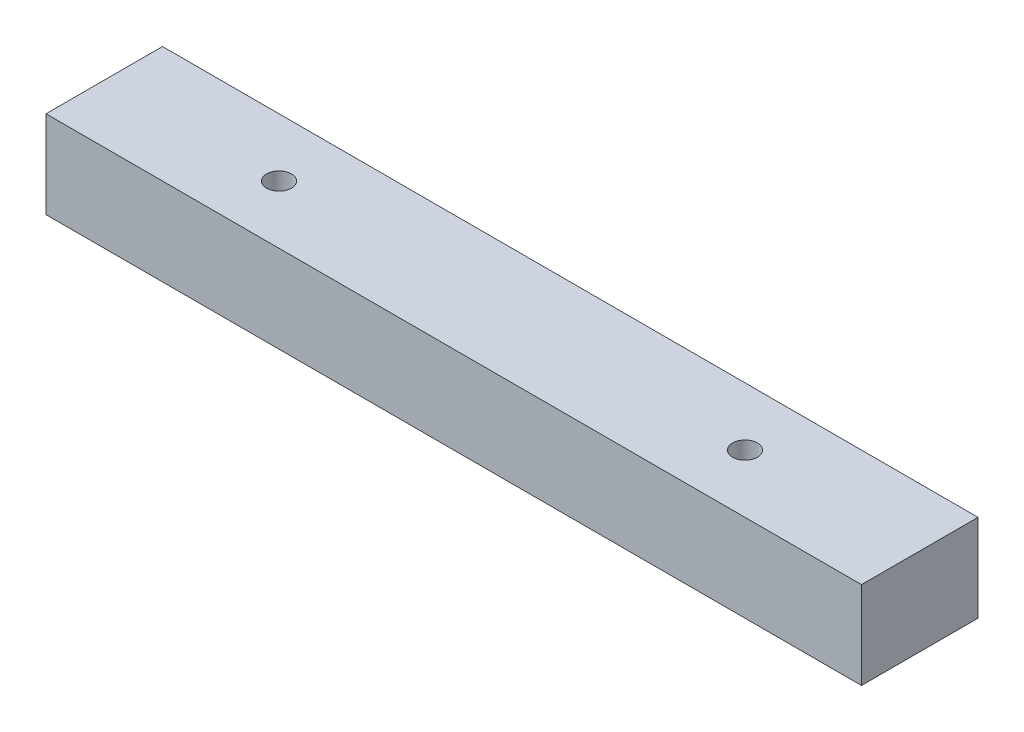
ISO-10303-21;
HEADER;
FILE_DESCRIPTION(('STEP AP214'),'2;1');
FILE_NAME('part.step','',(''),(''),'','','');
FILE_SCHEMA(('AUTOMOTIVE_DESIGN { 1 0 10303 214 1 1 1 1 }'));
ENDSEC;
DATA;
#1=APPLICATION_CONTEXT('core data for automotive mechanical design processes');
#2=APPLICATION_PROTOCOL_DEFINITION('international standard','automotive_design',2000,#1);
#3=PRODUCT_CONTEXT('',#1,'mechanical');
#4=PRODUCT('Part','Part','',(#3));
#5=PRODUCT_RELATED_PRODUCT_CATEGORY('part','',(#4));
#6=PRODUCT_DEFINITION_FORMATION('','',#4);
#7=PRODUCT_DEFINITION_CONTEXT('part definition',#1,'design');
#8=PRODUCT_DEFINITION('design','',#6,#7);
#9=PRODUCT_DEFINITION_SHAPE('','',#8);
#10=(LENGTH_UNIT() NAMED_UNIT(*) SI_UNIT(.MILLI.,.METRE.));
#11=(NAMED_UNIT(*) PLANE_ANGLE_UNIT() SI_UNIT($,.RADIAN.));
#12=(NAMED_UNIT(*) SI_UNIT($,.STERADIAN.) SOLID_ANGLE_UNIT());
#13=UNCERTAINTY_MEASURE_WITH_UNIT(LENGTH_MEASURE(1.E-05),#10,'distance_accuracy_value','');
#14=(GEOMETRIC_REPRESENTATION_CONTEXT(3) GLOBAL_UNCERTAINTY_ASSIGNED_CONTEXT((#13)) GLOBAL_UNIT_ASSIGNED_CONTEXT((#10,
#11,#12)) REPRESENTATION_CONTEXT('',''));
#15=CARTESIAN_POINT('',(0.,0.,0.));
#16=DIRECTION('',(0.,0.,1.));
#17=DIRECTION('',(1.,0.,0.));
#18=AXIS2_PLACEMENT_3D('',#15,#16,#17);
#19=CARTESIAN_POINT('',(-44.45,9.525,6.35000000000001));
#20=DIRECTION('',(1.,0.,0.));
#21=DIRECTION('',(0.,0.,-1.));
#22=AXIS2_PLACEMENT_3D('',#19,#20,#21);
#23=PLANE('',#22);
#24=DIRECTION('',(0.,0.,1.));
#25=VECTOR('',#24,1.);
#26=CARTESIAN_POINT('',(-44.45,0.,6.35000000000001));
#27=LINE('',#26,#25);
#28=CARTESIAN_POINT('',(-44.45,0.,-6.34999999999999));
#29=VERTEX_POINT('',#28);
#30=CARTESIAN_POINT('',(-44.45,0.,6.35000000000001));
#31=VERTEX_POINT('',#30);
#32=EDGE_CURVE('E97',#29,#31,#27,.T.);
#33=ORIENTED_EDGE('',*,*,#32,.T.);
#34=DIRECTION('',(0.,-1.,0.));
#35=VECTOR('',#34,1.);
#36=CARTESIAN_POINT('',(-44.45,9.525,6.35000000000001));
#37=LINE('',#36,#35);
#38=CARTESIAN_POINT('',(-44.45,9.525,6.35000000000001));
#39=VERTEX_POINT('',#38);
#40=EDGE_CURVE('E11',#39,#31,#37,.T.);
#41=ORIENTED_EDGE('',*,*,#40,.F.);
#42=DIRECTION('',(0.,0.,1.));
#43=VECTOR('',#42,1.);
#44=CARTESIAN_POINT('',(-44.45,9.525,6.35000000000001));
#45=LINE('',#44,#43);
#46=CARTESIAN_POINT('',(-44.45,9.525,-6.34999999999999));
#47=VERTEX_POINT('',#46);
#48=EDGE_CURVE('E85',#47,#39,#45,.T.);
#49=ORIENTED_EDGE('',*,*,#48,.F.);
#50=DIRECTION('',(0.,-1.,0.));
#51=VECTOR('',#50,1.);
#52=CARTESIAN_POINT('',(-44.45,9.525,-6.34999999999999));
#53=LINE('',#52,#51);
#54=EDGE_CURVE('E93',#47,#29,#53,.T.);
#55=ORIENTED_EDGE('',*,*,#54,.T.);
#56=EDGE_LOOP('',(#33,#41,#49,#55));
#57=FACE_BOUND('',#56,.T.);
#58=ADVANCED_FACE('F34',(#57),#23,.F.);
#59=CARTESIAN_POINT('',(44.45,9.525,6.35));
#60=DIRECTION('',(0.,0.,-1.));
#61=DIRECTION('',(-1.,0.,0.));
#62=AXIS2_PLACEMENT_3D('',#59,#60,#61);
#63=PLANE('',#62);
#64=DIRECTION('',(1.,0.,0.));
#65=VECTOR('',#64,1.);
#66=CARTESIAN_POINT('',(44.45,0.,6.35));
#67=LINE('',#66,#65);
#68=CARTESIAN_POINT('',(44.45,0.,6.35));
#69=VERTEX_POINT('',#68);
#70=EDGE_CURVE('E89',#31,#69,#67,.T.);
#71=ORIENTED_EDGE('',*,*,#70,.T.);
#72=DIRECTION('',(0.,-1.,0.));
#73=VECTOR('',#72,1.);
#74=CARTESIAN_POINT('',(44.45,9.525,6.35));
#75=LINE('',#74,#73);
#76=CARTESIAN_POINT('',(44.45,9.525,6.35));
#77=VERTEX_POINT('',#76);
#78=EDGE_CURVE('E42',#77,#69,#75,.T.);
#79=ORIENTED_EDGE('',*,*,#78,.F.);
#80=DIRECTION('',(1.,0.,0.));
#81=VECTOR('',#80,1.);
#82=CARTESIAN_POINT('',(44.45,9.525,6.35));
#83=LINE('',#82,#81);
#84=EDGE_CURVE('E80',#39,#77,#83,.T.);
#85=ORIENTED_EDGE('',*,*,#84,.F.);
#86=ORIENTED_EDGE('',*,*,#40,.T.);
#87=EDGE_LOOP('',(#71,#79,#85,#86));
#88=FACE_BOUND('',#87,.T.);
#89=ADVANCED_FACE('F88',(#88),#63,.F.);
#90=CARTESIAN_POINT('',(44.45,9.525,6.35));
#91=DIRECTION('',(-1.,0.,0.));
#92=DIRECTION('',(0.,0.,1.));
#93=AXIS2_PLACEMENT_3D('',#90,#91,#92);
#94=PLANE('',#93);
#95=DIRECTION('',(0.,0.,-1.));
#96=VECTOR('',#95,1.);
#97=CARTESIAN_POINT('',(44.45,0.,6.35));
#98=LINE('',#97,#96);
#99=CARTESIAN_POINT('',(44.45,0.,-6.35));
#100=VERTEX_POINT('',#99);
#101=EDGE_CURVE('E67',#69,#100,#98,.T.);
#102=ORIENTED_EDGE('',*,*,#101,.T.);
#103=DIRECTION('',(0.,-1.,0.));
#104=VECTOR('',#103,1.);
#105=CARTESIAN_POINT('',(44.45,9.525,-6.35));
#106=LINE('',#105,#104);
#107=CARTESIAN_POINT('',(44.45,9.525,-6.35));
#108=VERTEX_POINT('',#107);
#109=EDGE_CURVE('E90',#108,#100,#106,.T.);
#110=ORIENTED_EDGE('',*,*,#109,.F.);
#111=DIRECTION('',(0.,0.,-1.));
#112=VECTOR('',#111,1.);
#113=CARTESIAN_POINT('',(44.45,9.525,6.35));
#114=LINE('',#113,#112);
#115=EDGE_CURVE('E83',#77,#108,#114,.T.);
#116=ORIENTED_EDGE('',*,*,#115,.F.);
#117=ORIENTED_EDGE('',*,*,#78,.T.);
#118=EDGE_LOOP('',(#102,#110,#116,#117));
#119=FACE_BOUND('',#118,.T.);
#120=ADVANCED_FACE('F91',(#119),#94,.F.);
#121=CARTESIAN_POINT('',(44.45,9.525,-6.35));
#122=DIRECTION('',(0.,0.,1.));
#123=DIRECTION('',(1.,0.,0.));
#124=AXIS2_PLACEMENT_3D('',#121,#122,#123);
#125=PLANE('',#124);
#126=DIRECTION('',(-1.,0.,0.));
#127=VECTOR('',#126,1.);
#128=CARTESIAN_POINT('',(44.45,0.,-6.35));
#129=LINE('',#128,#127);
#130=EDGE_CURVE('E73',#100,#29,#129,.T.);
#131=ORIENTED_EDGE('',*,*,#130,.T.);
#132=ORIENTED_EDGE('',*,*,#54,.F.);
#133=DIRECTION('',(-1.,0.,0.));
#134=VECTOR('',#133,1.);
#135=CARTESIAN_POINT('',(44.45,9.525,-6.35));
#136=LINE('',#135,#134);
#137=EDGE_CURVE('E50',#108,#47,#136,.T.);
#138=ORIENTED_EDGE('',*,*,#137,.F.);
#139=ORIENTED_EDGE('',*,*,#109,.T.);
#140=EDGE_LOOP('',(#131,#132,#138,#139));
#141=FACE_BOUND('',#140,.T.);
#142=ADVANCED_FACE('F105',(#141),#125,.F.);
#143=CARTESIAN_POINT('',(-44.45,9.525,-6.34999999999999));
#144=DIRECTION('',(0.,1.,0.));
#145=DIRECTION('',(0.,0.,1.));
#146=AXIS2_PLACEMENT_3D('',#143,#144,#145);
#147=PLANE('',#146);
#148=CARTESIAN_POINT('',(25.4,9.525,0.));
#149=DIRECTION('',(0.,-1.,0.));
#150=DIRECTION('',(0.,0.,-1.));
#151=AXIS2_PLACEMENT_3D('',#148,#149,#150);
#152=CIRCLE('',#151,1.35255);
#153=CARTESIAN_POINT('',(25.4,9.525,-1.35255));
#154=VERTEX_POINT('',#153);
#155=EDGE_CURVE('E116',#154,#154,#152,.T.);
#156=ORIENTED_EDGE('',*,*,#155,.T.);
#157=EDGE_LOOP('',(#156));
#158=FACE_BOUND('',#157,.T.);
#159=CARTESIAN_POINT('',(-25.4,9.525,0.));
#160=DIRECTION('',(0.,-1.,0.));
#161=DIRECTION('',(0.,0.,-1.));
#162=AXIS2_PLACEMENT_3D('',#159,#160,#161);
#163=CIRCLE('',#162,1.35255);
#164=CARTESIAN_POINT('',(-25.4,9.525,-1.35255));
#165=VERTEX_POINT('',#164);
#166=EDGE_CURVE('E100',#165,#165,#163,.T.);
#167=ORIENTED_EDGE('',*,*,#166,.T.);
#168=EDGE_LOOP('',(#167));
#169=FACE_BOUND('',#168,.T.);
#170=ORIENTED_EDGE('',*,*,#48,.T.);
#171=ORIENTED_EDGE('',*,*,#84,.T.);
#172=ORIENTED_EDGE('',*,*,#115,.T.);
#173=ORIENTED_EDGE('',*,*,#137,.T.);
#174=EDGE_LOOP('',(#170,#171,#172,#173));
#175=FACE_BOUND('',#174,.T.);
#176=ADVANCED_FACE('F81',(#158,#169,#175),#147,.T.);
#177=CARTESIAN_POINT('',(-44.45,0.,-6.34999999999999));
#178=DIRECTION('',(0.,1.,0.));
#179=DIRECTION('',(0.,0.,1.));
#180=AXIS2_PLACEMENT_3D('',#177,#178,#179);
#181=PLANE('',#180);
#182=CARTESIAN_POINT('',(25.4,0.,0.));
#183=DIRECTION('',(0.,-1.,0.));
#184=DIRECTION('',(0.,0.,-1.));
#185=AXIS2_PLACEMENT_3D('',#182,#183,#184);
#186=CIRCLE('',#185,1.35255);
#187=CARTESIAN_POINT('',(25.4,0.,-1.35255));
#188=VERTEX_POINT('',#187);
#189=EDGE_CURVE('E119',#188,#188,#186,.T.);
#190=ORIENTED_EDGE('',*,*,#189,.F.);
#191=EDGE_LOOP('',(#190));
#192=FACE_BOUND('',#191,.T.);
#193=CARTESIAN_POINT('',(-25.4,0.,0.));
#194=DIRECTION('',(0.,-1.,0.));
#195=DIRECTION('',(0.,0.,-1.));
#196=AXIS2_PLACEMENT_3D('',#193,#194,#195);
#197=CIRCLE('',#196,1.35255);
#198=CARTESIAN_POINT('',(-25.4,0.,-1.35255));
#199=VERTEX_POINT('',#198);
#200=EDGE_CURVE('E113',#199,#199,#197,.T.);
#201=ORIENTED_EDGE('',*,*,#200,.F.);
#202=EDGE_LOOP('',(#201));
#203=FACE_BOUND('',#202,.T.);
#204=ORIENTED_EDGE('',*,*,#32,.F.);
#205=ORIENTED_EDGE('',*,*,#130,.F.);
#206=ORIENTED_EDGE('',*,*,#101,.F.);
#207=ORIENTED_EDGE('',*,*,#70,.F.);
#208=EDGE_LOOP('',(#204,#205,#206,#207));
#209=FACE_BOUND('',#208,.T.);
#210=ADVANCED_FACE('F108',(#192,#203,#209),#181,.F.);
#211=CARTESIAN_POINT('',(-25.4,0.,0.));
#212=DIRECTION('',(0.,-1.,0.));
#213=DIRECTION('',(0.,0.,-1.));
#214=AXIS2_PLACEMENT_3D('',#211,#212,#213);
#215=CYLINDRICAL_SURFACE('',#214,1.35255);
#216=ORIENTED_EDGE('',*,*,#166,.F.);
#217=EDGE_LOOP('',(#216));
#218=FACE_BOUND('',#217,.T.);
#219=ORIENTED_EDGE('',*,*,#200,.T.);
#220=EDGE_LOOP('',(#219));
#221=FACE_BOUND('',#220,.T.);
#222=ADVANCED_FACE('F127',(#218,#221),#215,.F.);
#223=CARTESIAN_POINT('',(25.4,0.,0.));
#224=DIRECTION('',(0.,-1.,0.));
#225=DIRECTION('',(0.,0.,-1.));
#226=AXIS2_PLACEMENT_3D('',#223,#224,#225);
#227=CYLINDRICAL_SURFACE('',#226,1.35255);
#228=ORIENTED_EDGE('',*,*,#155,.F.);
#229=EDGE_LOOP('',(#228));
#230=FACE_BOUND('',#229,.T.);
#231=ORIENTED_EDGE('',*,*,#189,.T.);
#232=EDGE_LOOP('',(#231));
#233=FACE_BOUND('',#232,.T.);
#234=ADVANCED_FACE('F123',(#230,#233),#227,.F.);
#235=CLOSED_SHELL('',(#58,#89,#120,#142,#176,#210,#222,#234));
#236=MANIFOLD_SOLID_BREP('B2',#235);
#237=ADVANCED_BREP_SHAPE_REPRESENTATION('',(#18,#236),#14);
#238=SHAPE_DEFINITION_REPRESENTATION(#9,#237);
ENDSEC;
END-ISO-10303-21;
